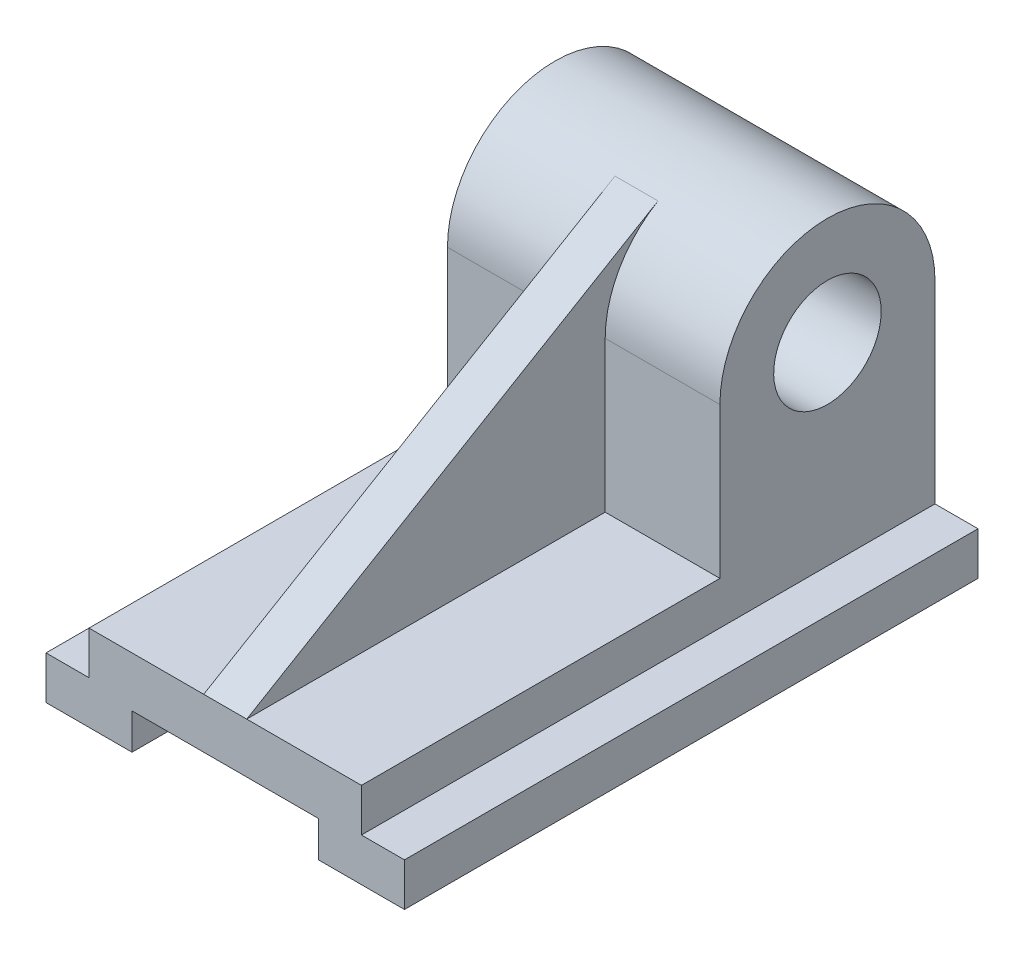
ISO-10303-21;
HEADER;
FILE_DESCRIPTION(('STEP AP214'),'2;1');
FILE_NAME('part.step','',(''),(''),'','','');
FILE_SCHEMA(('AUTOMOTIVE_DESIGN { 1 0 10303 214 1 1 1 1 }'));
ENDSEC;
DATA;
#1=APPLICATION_CONTEXT('core data for automotive mechanical design processes');
#2=APPLICATION_PROTOCOL_DEFINITION('international standard','automotive_design',2000,#1);
#3=PRODUCT_CONTEXT('',#1,'mechanical');
#4=PRODUCT('Part','Part','',(#3));
#5=PRODUCT_RELATED_PRODUCT_CATEGORY('part','',(#4));
#6=PRODUCT_DEFINITION_FORMATION('','',#4);
#7=PRODUCT_DEFINITION_CONTEXT('part definition',#1,'design');
#8=PRODUCT_DEFINITION('design','',#6,#7);
#9=PRODUCT_DEFINITION_SHAPE('','',#8);
#10=(LENGTH_UNIT() NAMED_UNIT(*) SI_UNIT(.MILLI.,.METRE.));
#11=(NAMED_UNIT(*) PLANE_ANGLE_UNIT() SI_UNIT($,.RADIAN.));
#12=(NAMED_UNIT(*) SI_UNIT($,.STERADIAN.) SOLID_ANGLE_UNIT());
#13=UNCERTAINTY_MEASURE_WITH_UNIT(LENGTH_MEASURE(1.E-05),#10,'distance_accuracy_value','');
#14=(GEOMETRIC_REPRESENTATION_CONTEXT(3) GLOBAL_UNCERTAINTY_ASSIGNED_CONTEXT((#13)) GLOBAL_UNIT_ASSIGNED_CONTEXT((#10,
#11,#12)) REPRESENTATION_CONTEXT('',''));
#15=CARTESIAN_POINT('',(0.,0.,0.));
#16=DIRECTION('',(0.,0.,1.));
#17=DIRECTION('',(1.,0.,0.));
#18=AXIS2_PLACEMENT_3D('',#15,#16,#17);
#19=CARTESIAN_POINT('',(0.,12.,80.));
#20=DIRECTION('',(0.,1.,0.));
#21=DIRECTION('',(0.,0.,1.));
#22=AXIS2_PLACEMENT_3D('',#19,#20,#21);
#23=PLANE('',#22);
#24=DIRECTION('',(1.,0.,0.));
#25=VECTOR('',#24,1.);
#26=CARTESIAN_POINT('',(0.,12.,80.));
#27=LINE('',#26,#25);
#28=CARTESIAN_POINT('',(-38.,12.,80.));
#29=VERTEX_POINT('',#28);
#30=CARTESIAN_POINT('',(-6.,12.,80.));
#31=VERTEX_POINT('',#30);
#32=EDGE_CURVE('E191',#29,#31,#27,.T.);
#33=ORIENTED_EDGE('',*,*,#32,.T.);
#34=DIRECTION('',(0.,0.,-1.));
#35=VECTOR('',#34,1.);
#36=CARTESIAN_POINT('',(-6.,12.,80.));
#37=LINE('',#36,#35);
#38=CARTESIAN_POINT('',(-6.,12.,-20.));
#39=VERTEX_POINT('',#38);
#40=EDGE_CURVE('E169',#31,#39,#37,.T.);
#41=ORIENTED_EDGE('',*,*,#40,.T.);
#42=DIRECTION('',(1.,0.,0.));
#43=VECTOR('',#42,1.);
#44=CARTESIAN_POINT('',(-38.,12.,-20.));
#45=LINE('',#44,#43);
#46=CARTESIAN_POINT('',(-38.,12.,-20.));
#47=VERTEX_POINT('',#46);
#48=EDGE_CURVE('E69',#47,#39,#45,.T.);
#49=ORIENTED_EDGE('',*,*,#48,.F.);
#50=DIRECTION('',(0.,0.,-1.));
#51=VECTOR('',#50,1.);
#52=CARTESIAN_POINT('',(-38.,12.,80.));
#53=LINE('',#52,#51);
#54=EDGE_CURVE('E198',#29,#47,#53,.T.);
#55=ORIENTED_EDGE('',*,*,#54,.F.);
#56=EDGE_LOOP('',(#33,#41,#49,#55));
#57=FACE_BOUND('',#56,.T.);
#58=ADVANCED_FACE('F45',(#57),#23,.T.);
#59=CARTESIAN_POINT('',(-38.,54.,-20.));
#60=DIRECTION('',(0.,0.,-1.));
#61=DIRECTION('',(-1.,0.,0.));
#62=AXIS2_PLACEMENT_3D('',#59,#60,#61);
#63=PLANE('',#62);
#64=DIRECTION('',(0.,-1.,0.));
#65=VECTOR('',#64,1.);
#66=CARTESIAN_POINT('',(-6.,54.,-20.));
#67=LINE('',#66,#65);
#68=CARTESIAN_POINT('',(-6.00000000000001,54.,-20.));
#69=VERTEX_POINT('',#68);
#70=EDGE_CURVE('E172',#69,#39,#67,.T.);
#71=ORIENTED_EDGE('',*,*,#70,.F.);
#72=DIRECTION('',(1.,0.,0.));
#73=VECTOR('',#72,1.);
#74=CARTESIAN_POINT('',(-38.,54.,-20.));
#75=LINE('',#74,#73);
#76=CARTESIAN_POINT('',(-38.,54.,-20.));
#77=VERTEX_POINT('',#76);
#78=EDGE_CURVE('E323',#77,#69,#75,.T.);
#79=ORIENTED_EDGE('',*,*,#78,.F.);
#80=DIRECTION('',(0.,-1.,0.));
#81=VECTOR('',#80,1.);
#82=CARTESIAN_POINT('',(-38.,54.,-20.));
#83=LINE('',#82,#81);
#84=EDGE_CURVE('E230',#77,#47,#83,.T.);
#85=ORIENTED_EDGE('',*,*,#84,.T.);
#86=ORIENTED_EDGE('',*,*,#48,.T.);
#87=EDGE_LOOP('',(#71,#79,#85,#86));
#88=FACE_BOUND('',#87,.T.);
#89=ADVANCED_FACE('F386',(#88),#63,.F.);
#90=CARTESIAN_POINT('',(26.,0.,80.));
#91=DIRECTION('',(-1.,0.,0.));
#92=DIRECTION('',(0.,0.,1.));
#93=AXIS2_PLACEMENT_3D('',#90,#91,#92);
#94=PLANE('',#93);
#95=DIRECTION('',(0.,1.,0.));
#96=VECTOR('',#95,1.);
#97=CARTESIAN_POINT('',(26.,0.,-80.));
#98=LINE('',#97,#96);
#99=CARTESIAN_POINT('',(26.,-12.,-80.));
#100=VERTEX_POINT('',#99);
#101=CARTESIAN_POINT('',(26.,-2.,-80.));
#102=VERTEX_POINT('',#101);
#103=EDGE_CURVE('E225',#100,#102,#98,.T.);
#104=ORIENTED_EDGE('',*,*,#103,.F.);
#105=DIRECTION('',(0.,0.,-1.));
#106=VECTOR('',#105,1.);
#107=CARTESIAN_POINT('',(26.,-12.,80.));
#108=LINE('',#107,#106);
#109=CARTESIAN_POINT('',(26.,-12.,80.));
#110=VERTEX_POINT('',#109);
#111=EDGE_CURVE('E54',#110,#100,#108,.T.);
#112=ORIENTED_EDGE('',*,*,#111,.F.);
#113=DIRECTION('',(0.,1.,0.));
#114=VECTOR('',#113,1.);
#115=CARTESIAN_POINT('',(26.,0.,80.));
#116=LINE('',#115,#114);
#117=CARTESIAN_POINT('',(26.,-2.,80.));
#118=VERTEX_POINT('',#117);
#119=EDGE_CURVE('E264',#110,#118,#116,.T.);
#120=ORIENTED_EDGE('',*,*,#119,.T.);
#121=DIRECTION('',(0.,0.,-1.));
#122=VECTOR('',#121,1.);
#123=CARTESIAN_POINT('',(26.,-2.,80.));
#124=LINE('',#123,#122);
#125=EDGE_CURVE('E224',#118,#102,#124,.T.);
#126=ORIENTED_EDGE('',*,*,#125,.T.);
#127=EDGE_LOOP('',(#104,#112,#120,#126));
#128=FACE_BOUND('',#127,.T.);
#129=ADVANCED_FACE('F47',(#128),#94,.T.);
#130=CARTESIAN_POINT('',(0.,-12.,80.));
#131=DIRECTION('',(0.,1.,0.));
#132=DIRECTION('',(0.,0.,1.));
#133=AXIS2_PLACEMENT_3D('',#130,#131,#132);
#134=PLANE('',#133);
#135=DIRECTION('',(1.,0.,0.));
#136=VECTOR('',#135,1.);
#137=CARTESIAN_POINT('',(0.,-12.,-80.));
#138=LINE('',#137,#136);
#139=CARTESIAN_POINT('',(50.,-12.,-80.));
#140=VERTEX_POINT('',#139);
#141=EDGE_CURVE('E229',#100,#140,#138,.T.);
#142=ORIENTED_EDGE('',*,*,#141,.T.);
#143=DIRECTION('',(0.,0.,-1.));
#144=VECTOR('',#143,1.);
#145=CARTESIAN_POINT('',(50.,-12.,80.));
#146=LINE('',#145,#144);
#147=CARTESIAN_POINT('',(50.,-12.,80.));
#148=VERTEX_POINT('',#147);
#149=EDGE_CURVE('E298',#148,#140,#146,.T.);
#150=ORIENTED_EDGE('',*,*,#149,.F.);
#151=DIRECTION('',(1.,0.,0.));
#152=VECTOR('',#151,1.);
#153=CARTESIAN_POINT('',(0.,-12.,80.));
#154=LINE('',#153,#152);
#155=EDGE_CURVE('E343',#110,#148,#154,.T.);
#156=ORIENTED_EDGE('',*,*,#155,.F.);
#157=ORIENTED_EDGE('',*,*,#111,.T.);
#158=EDGE_LOOP('',(#142,#150,#156,#157));
#159=FACE_BOUND('',#158,.T.);
#160=ADVANCED_FACE('F421',(#159),#134,.F.);
#161=CARTESIAN_POINT('',(50.,0.,80.));
#162=DIRECTION('',(1.,0.,0.));
#163=DIRECTION('',(0.,0.,-1.));
#164=AXIS2_PLACEMENT_3D('',#161,#162,#163);
#165=PLANE('',#164);
#166=DIRECTION('',(0.,-1.,0.));
#167=VECTOR('',#166,1.);
#168=CARTESIAN_POINT('',(50.,0.,-80.));
#169=LINE('',#168,#167);
#170=CARTESIAN_POINT('',(50.,0.,-80.));
#171=VERTEX_POINT('',#170);
#172=EDGE_CURVE('E234',#171,#140,#169,.T.);
#173=ORIENTED_EDGE('',*,*,#172,.F.);
#174=DIRECTION('',(0.,0.,-1.));
#175=VECTOR('',#174,1.);
#176=CARTESIAN_POINT('',(50.,0.,80.));
#177=LINE('',#176,#175);
#178=CARTESIAN_POINT('',(50.,0.,80.));
#179=VERTEX_POINT('',#178);
#180=EDGE_CURVE('E295',#179,#171,#177,.T.);
#181=ORIENTED_EDGE('',*,*,#180,.F.);
#182=DIRECTION('',(0.,-1.,0.));
#183=VECTOR('',#182,1.);
#184=CARTESIAN_POINT('',(50.,0.,80.));
#185=LINE('',#184,#183);
#186=EDGE_CURVE('E346',#179,#148,#185,.T.);
#187=ORIENTED_EDGE('',*,*,#186,.T.);
#188=ORIENTED_EDGE('',*,*,#149,.T.);
#189=EDGE_LOOP('',(#173,#181,#187,#188));
#190=FACE_BOUND('',#189,.T.);
#191=ADVANCED_FACE('F425',(#190),#165,.T.);
#192=CARTESIAN_POINT('',(0.,0.,80.));
#193=DIRECTION('',(0.,-1.,0.));
#194=DIRECTION('',(1.,0.,0.));
#195=AXIS2_PLACEMENT_3D('',#192,#193,#194);
#196=PLANE('',#195);
#197=DIRECTION('',(-1.,0.,0.));
#198=VECTOR('',#197,1.);
#199=CARTESIAN_POINT('',(0.,0.,-80.));
#200=LINE('',#199,#198);
#201=CARTESIAN_POINT('',(38.,0.,-80.));
#202=VERTEX_POINT('',#201);
#203=EDGE_CURVE('E239',#171,#202,#200,.T.);
#204=ORIENTED_EDGE('',*,*,#203,.T.);
#205=DIRECTION('',(0.,0.,-1.));
#206=VECTOR('',#205,1.);
#207=CARTESIAN_POINT('',(38.,0.,80.));
#208=LINE('',#207,#206);
#209=CARTESIAN_POINT('',(38.,0.,80.));
#210=VERTEX_POINT('',#209);
#211=EDGE_CURVE('E292',#210,#202,#208,.T.);
#212=ORIENTED_EDGE('',*,*,#211,.F.);
#213=DIRECTION('',(-1.,0.,0.));
#214=VECTOR('',#213,1.);
#215=CARTESIAN_POINT('',(0.,0.,80.));
#216=LINE('',#215,#214);
#217=EDGE_CURVE('E349',#179,#210,#216,.T.);
#218=ORIENTED_EDGE('',*,*,#217,.F.);
#219=ORIENTED_EDGE('',*,*,#180,.T.);
#220=EDGE_LOOP('',(#204,#212,#218,#219));
#221=FACE_BOUND('',#220,.T.);
#222=ADVANCED_FACE('F428',(#221),#196,.F.);
#223=CARTESIAN_POINT('',(38.,0.,80.));
#224=DIRECTION('',(1.,0.,0.));
#225=DIRECTION('',(0.,1.,0.));
#226=AXIS2_PLACEMENT_3D('',#223,#224,#225);
#227=PLANE('',#226);
#228=CARTESIAN_POINT('',(38.,54.,-50.));
#229=DIRECTION('',(1.,0.,0.));
#230=DIRECTION('',(0.,1.,0.));
#231=AXIS2_PLACEMENT_3D('',#228,#229,#230);
#232=CIRCLE('',#231,15.);
#233=CARTESIAN_POINT('',(38.,69.,-50.));
#234=VERTEX_POINT('',#233);
#235=EDGE_CURVE('E195',#234,#234,#232,.T.);
#236=ORIENTED_EDGE('',*,*,#235,.F.);
#237=EDGE_LOOP('',(#236));
#238=FACE_BOUND('',#237,.T.);
#239=DIRECTION('',(0.,-1.,0.));
#240=VECTOR('',#239,1.);
#241=CARTESIAN_POINT('',(38.,0.,-80.));
#242=LINE('',#241,#240);
#243=CARTESIAN_POINT('',(38.,54.,-80.));
#244=VERTEX_POINT('',#243);
#245=EDGE_CURVE('E243',#244,#202,#242,.T.);
#246=ORIENTED_EDGE('',*,*,#245,.F.);
#247=CARTESIAN_POINT('',(38.,54.,-50.));
#248=DIRECTION('',(1.,0.,0.));
#249=DIRECTION('',(0.,1.,0.));
#250=AXIS2_PLACEMENT_3D('',#247,#248,#249);
#251=CIRCLE('',#250,30.);
#252=CARTESIAN_POINT('',(38.,54.,-20.));
#253=VERTEX_POINT('',#252);
#254=EDGE_CURVE('E305',#244,#253,#251,.T.);
#255=ORIENTED_EDGE('',*,*,#254,.T.);
#256=DIRECTION('',(0.,-1.,0.));
#257=VECTOR('',#256,1.);
#258=CARTESIAN_POINT('',(38.,54.,-20.));
#259=LINE('',#258,#257);
#260=CARTESIAN_POINT('',(38.,12.,-20.));
#261=VERTEX_POINT('',#260);
#262=EDGE_CURVE('E331',#253,#261,#259,.T.);
#263=ORIENTED_EDGE('',*,*,#262,.T.);
#264=DIRECTION('',(0.,0.,-1.));
#265=VECTOR('',#264,1.);
#266=CARTESIAN_POINT('',(38.,12.,80.));
#267=LINE('',#266,#265);
#268=CARTESIAN_POINT('',(38.,12.,80.));
#269=VERTEX_POINT('',#268);
#270=EDGE_CURVE('E288',#269,#261,#267,.T.);
#271=ORIENTED_EDGE('',*,*,#270,.F.);
#272=DIRECTION('',(0.,-1.,0.));
#273=VECTOR('',#272,1.);
#274=CARTESIAN_POINT('',(38.,0.,80.));
#275=LINE('',#274,#273);
#276=EDGE_CURVE('E207',#269,#210,#275,.T.);
#277=ORIENTED_EDGE('',*,*,#276,.T.);
#278=ORIENTED_EDGE('',*,*,#211,.T.);
#279=EDGE_LOOP('',(#246,#255,#263,#271,#277,#278));
#280=FACE_BOUND('',#279,.T.);
#281=ADVANCED_FACE('F358',(#238,#280),#227,.T.);
#282=DIRECTION('',(0.,0.,-1.));
#283=VECTOR('',#282,1.);
#284=CARTESIAN_POINT('',(6.,12.,80.));
#285=LINE('',#284,#283);
#286=CARTESIAN_POINT('',(6.,12.,80.));
#287=VERTEX_POINT('',#286);
#288=CARTESIAN_POINT('',(6.,12.,-20.));
#289=VERTEX_POINT('',#288);
#290=EDGE_CURVE('E196',#287,#289,#285,.T.);
#291=ORIENTED_EDGE('',*,*,#290,.F.);
#292=EDGE_CURVE('E193',#287,#269,#27,.T.);
#293=ORIENTED_EDGE('',*,*,#292,.T.);
#294=ORIENTED_EDGE('',*,*,#270,.T.);
#295=EDGE_CURVE('E322',#289,#261,#45,.T.);
#296=ORIENTED_EDGE('',*,*,#295,.F.);
#297=EDGE_LOOP('',(#291,#293,#294,#296));
#298=FACE_BOUND('',#297,.T.);
#299=ADVANCED_FACE('F363',(#298),#23,.T.);
#300=CARTESIAN_POINT('',(-38.,0.,80.));
#301=DIRECTION('',(1.,0.,0.));
#302=DIRECTION('',(0.,1.,0.));
#303=AXIS2_PLACEMENT_3D('',#300,#301,#302);
#304=PLANE('',#303);
#305=CARTESIAN_POINT('',(-38.,54.,-50.));
#306=DIRECTION('',(1.,0.,0.));
#307=DIRECTION('',(0.,1.,0.));
#308=AXIS2_PLACEMENT_3D('',#305,#306,#307);
#309=CIRCLE('',#308,15.);
#310=CARTESIAN_POINT('',(-38.,69.,-50.));
#311=VERTEX_POINT('',#310);
#312=EDGE_CURVE('E302',#311,#311,#309,.T.);
#313=ORIENTED_EDGE('',*,*,#312,.T.);
#314=EDGE_LOOP('',(#313));
#315=FACE_BOUND('',#314,.T.);
#316=ORIENTED_EDGE('',*,*,#84,.F.);
#317=CARTESIAN_POINT('',(-38.,54.,-50.));
#318=DIRECTION('',(1.,0.,0.));
#319=DIRECTION('',(0.,1.,0.));
#320=AXIS2_PLACEMENT_3D('',#317,#318,#319);
#321=CIRCLE('',#320,30.);
#322=CARTESIAN_POINT('',(-38.,54.,-80.));
#323=VERTEX_POINT('',#322);
#324=EDGE_CURVE('E311',#77,#323,#321,.F.);
#325=ORIENTED_EDGE('',*,*,#324,.T.);
#326=DIRECTION('',(0.,-1.,0.));
#327=VECTOR('',#326,1.);
#328=CARTESIAN_POINT('',(-38.,0.,-80.));
#329=LINE('',#328,#327);
#330=CARTESIAN_POINT('',(-38.,0.,-80.));
#331=VERTEX_POINT('',#330);
#332=EDGE_CURVE('E247',#323,#331,#329,.T.);
#333=ORIENTED_EDGE('',*,*,#332,.T.);
#334=DIRECTION('',(0.,0.,-1.));
#335=VECTOR('',#334,1.);
#336=CARTESIAN_POINT('',(-38.,0.,80.));
#337=LINE('',#336,#335);
#338=CARTESIAN_POINT('',(-38.,0.,80.));
#339=VERTEX_POINT('',#338);
#340=EDGE_CURVE('E283',#339,#331,#337,.T.);
#341=ORIENTED_EDGE('',*,*,#340,.F.);
#342=DIRECTION('',(0.,-1.,0.));
#343=VECTOR('',#342,1.);
#344=CARTESIAN_POINT('',(-38.,0.,80.));
#345=LINE('',#344,#343);
#346=EDGE_CURVE('E201',#29,#339,#345,.T.);
#347=ORIENTED_EDGE('',*,*,#346,.F.);
#348=ORIENTED_EDGE('',*,*,#54,.T.);
#349=EDGE_LOOP('',(#316,#325,#333,#341,#347,#348));
#350=FACE_BOUND('',#349,.T.);
#351=ADVANCED_FACE('F388',(#315,#350),#304,.F.);
#352=CARTESIAN_POINT('',(0.,0.,80.));
#353=DIRECTION('',(0.,1.,0.));
#354=DIRECTION('',(0.,0.,1.));
#355=AXIS2_PLACEMENT_3D('',#352,#353,#354);
#356=PLANE('',#355);
#357=DIRECTION('',(1.,0.,0.));
#358=VECTOR('',#357,1.);
#359=CARTESIAN_POINT('',(0.,0.,-80.));
#360=LINE('',#359,#358);
#361=CARTESIAN_POINT('',(-50.,0.,-80.));
#362=VERTEX_POINT('',#361);
#363=EDGE_CURVE('E251',#362,#331,#360,.T.);
#364=ORIENTED_EDGE('',*,*,#363,.F.);
#365=DIRECTION('',(0.,0.,-1.));
#366=VECTOR('',#365,1.);
#367=CARTESIAN_POINT('',(-50.,0.,80.));
#368=LINE('',#367,#366);
#369=CARTESIAN_POINT('',(-50.,0.,80.));
#370=VERTEX_POINT('',#369);
#371=EDGE_CURVE('E280',#370,#362,#368,.T.);
#372=ORIENTED_EDGE('',*,*,#371,.F.);
#373=DIRECTION('',(1.,0.,0.));
#374=VECTOR('',#373,1.);
#375=CARTESIAN_POINT('',(0.,0.,80.));
#376=LINE('',#375,#374);
#377=EDGE_CURVE('E205',#370,#339,#376,.T.);
#378=ORIENTED_EDGE('',*,*,#377,.T.);
#379=ORIENTED_EDGE('',*,*,#340,.T.);
#380=EDGE_LOOP('',(#364,#372,#378,#379));
#381=FACE_BOUND('',#380,.T.);
#382=ADVANCED_FACE('F395',(#381),#356,.T.);
#383=CARTESIAN_POINT('',(-50.,0.,80.));
#384=DIRECTION('',(1.,0.,0.));
#385=DIRECTION('',(0.,0.,-1.));
#386=AXIS2_PLACEMENT_3D('',#383,#384,#385);
#387=PLANE('',#386);
#388=DIRECTION('',(0.,-1.,0.));
#389=VECTOR('',#388,1.);
#390=CARTESIAN_POINT('',(-50.,0.,-80.));
#391=LINE('',#390,#389);
#392=CARTESIAN_POINT('',(-50.,-12.,-80.));
#393=VERTEX_POINT('',#392);
#394=EDGE_CURVE('E255',#362,#393,#391,.T.);
#395=ORIENTED_EDGE('',*,*,#394,.T.);
#396=DIRECTION('',(0.,0.,-1.));
#397=VECTOR('',#396,1.);
#398=CARTESIAN_POINT('',(-50.,-12.,80.));
#399=LINE('',#398,#397);
#400=CARTESIAN_POINT('',(-50.,-12.,80.));
#401=VERTEX_POINT('',#400);
#402=EDGE_CURVE('E276',#401,#393,#399,.T.);
#403=ORIENTED_EDGE('',*,*,#402,.F.);
#404=DIRECTION('',(0.,-1.,0.));
#405=VECTOR('',#404,1.);
#406=CARTESIAN_POINT('',(-50.,0.,80.));
#407=LINE('',#406,#405);
#408=EDGE_CURVE('E214',#370,#401,#407,.T.);
#409=ORIENTED_EDGE('',*,*,#408,.F.);
#410=ORIENTED_EDGE('',*,*,#371,.T.);
#411=EDGE_LOOP('',(#395,#403,#409,#410));
#412=FACE_BOUND('',#411,.T.);
#413=ADVANCED_FACE('F398',(#412),#387,.F.);
#414=CARTESIAN_POINT('',(-26.,-12.,-80.));
#415=VERTEX_POINT('',#414);
#416=EDGE_CURVE('E235',#393,#415,#138,.T.);
#417=ORIENTED_EDGE('',*,*,#416,.T.);
#418=DIRECTION('',(0.,0.,-1.));
#419=VECTOR('',#418,1.);
#420=CARTESIAN_POINT('',(-26.,-12.,80.));
#421=LINE('',#420,#419);
#422=CARTESIAN_POINT('',(-26.,-12.,80.));
#423=VERTEX_POINT('',#422);
#424=EDGE_CURVE('E272',#423,#415,#421,.T.);
#425=ORIENTED_EDGE('',*,*,#424,.F.);
#426=EDGE_CURVE('E217',#401,#423,#154,.T.);
#427=ORIENTED_EDGE('',*,*,#426,.F.);
#428=ORIENTED_EDGE('',*,*,#402,.T.);
#429=EDGE_LOOP('',(#417,#425,#427,#428));
#430=FACE_BOUND('',#429,.T.);
#431=ADVANCED_FACE('F403',(#430),#134,.F.);
#432=CARTESIAN_POINT('',(-26.,0.,80.));
#433=DIRECTION('',(-1.,0.,0.));
#434=DIRECTION('',(0.,0.,1.));
#435=AXIS2_PLACEMENT_3D('',#432,#433,#434);
#436=PLANE('',#435);
#437=DIRECTION('',(0.,1.,0.));
#438=VECTOR('',#437,1.);
#439=CARTESIAN_POINT('',(-26.,0.,-80.));
#440=LINE('',#439,#438);
#441=CARTESIAN_POINT('',(-26.,-2.,-80.));
#442=VERTEX_POINT('',#441);
#443=EDGE_CURVE('E258',#415,#442,#440,.T.);
#444=ORIENTED_EDGE('',*,*,#443,.T.);
#445=DIRECTION('',(0.,0.,-1.));
#446=VECTOR('',#445,1.);
#447=CARTESIAN_POINT('',(-26.,-2.,80.));
#448=LINE('',#447,#446);
#449=CARTESIAN_POINT('',(-26.,-2.,80.));
#450=VERTEX_POINT('',#449);
#451=EDGE_CURVE('E268',#450,#442,#448,.T.);
#452=ORIENTED_EDGE('',*,*,#451,.F.);
#453=DIRECTION('',(0.,1.,0.));
#454=VECTOR('',#453,1.);
#455=CARTESIAN_POINT('',(-26.,0.,80.));
#456=LINE('',#455,#454);
#457=EDGE_CURVE('E218',#423,#450,#456,.T.);
#458=ORIENTED_EDGE('',*,*,#457,.F.);
#459=ORIENTED_EDGE('',*,*,#424,.T.);
#460=EDGE_LOOP('',(#444,#452,#458,#459));
#461=FACE_BOUND('',#460,.T.);
#462=ADVANCED_FACE('F411',(#461),#436,.F.);
#463=CARTESIAN_POINT('',(0.,-2.,80.));
#464=DIRECTION('',(0.,1.,0.));
#465=DIRECTION('',(0.,0.,1.));
#466=AXIS2_PLACEMENT_3D('',#463,#464,#465);
#467=PLANE('',#466);
#468=ORIENTED_EDGE('',*,*,#125,.F.);
#469=DIRECTION('',(1.,0.,0.));
#470=VECTOR('',#469,1.);
#471=CARTESIAN_POINT('',(0.,-2.,80.));
#472=LINE('',#471,#470);
#473=EDGE_CURVE('E221',#450,#118,#472,.T.);
#474=ORIENTED_EDGE('',*,*,#473,.F.);
#475=ORIENTED_EDGE('',*,*,#451,.T.);
#476=DIRECTION('',(1.,0.,0.));
#477=VECTOR('',#476,1.);
#478=CARTESIAN_POINT('',(0.,-2.,-80.));
#479=LINE('',#478,#477);
#480=EDGE_CURVE('E261',#442,#102,#479,.T.);
#481=ORIENTED_EDGE('',*,*,#480,.T.);
#482=EDGE_LOOP('',(#468,#474,#475,#481));
#483=FACE_BOUND('',#482,.T.);
#484=ADVANCED_FACE('F415',(#483),#467,.F.);
#485=CARTESIAN_POINT('',(0.,0.,80.));
#486=DIRECTION('',(0.,0.,1.));
#487=DIRECTION('',(1.,0.,0.));
#488=AXIS2_PLACEMENT_3D('',#485,#486,#487);
#489=PLANE('',#488);
#490=ORIENTED_EDGE('',*,*,#292,.F.);
#491=DIRECTION('',(1.,0.,0.));
#492=VECTOR('',#491,1.);
#493=CARTESIAN_POINT('',(0.,12.,80.));
#494=LINE('',#493,#492);
#495=EDGE_CURVE('E181',#287,#31,#494,.F.);
#496=ORIENTED_EDGE('',*,*,#495,.T.);
#497=ORIENTED_EDGE('',*,*,#32,.F.);
#498=ORIENTED_EDGE('',*,*,#346,.T.);
#499=ORIENTED_EDGE('',*,*,#377,.F.);
#500=ORIENTED_EDGE('',*,*,#408,.T.);
#501=ORIENTED_EDGE('',*,*,#426,.T.);
#502=ORIENTED_EDGE('',*,*,#457,.T.);
#503=ORIENTED_EDGE('',*,*,#473,.T.);
#504=ORIENTED_EDGE('',*,*,#119,.F.);
#505=ORIENTED_EDGE('',*,*,#155,.T.);
#506=ORIENTED_EDGE('',*,*,#186,.F.);
#507=ORIENTED_EDGE('',*,*,#217,.T.);
#508=ORIENTED_EDGE('',*,*,#276,.F.);
#509=EDGE_LOOP('',(#490,#496,#497,#498,#499,#500,#501,#502,#503,#504,#505,#506,#507,#508));
#510=FACE_BOUND('',#509,.T.);
#511=ADVANCED_FACE('F190',(#510),#489,.T.);
#512=CARTESIAN_POINT('',(0.,0.,-80.));
#513=DIRECTION('',(0.,0.,1.));
#514=DIRECTION('',(1.,0.,0.));
#515=AXIS2_PLACEMENT_3D('',#512,#513,#514);
#516=PLANE('',#515);
#517=ORIENTED_EDGE('',*,*,#103,.T.);
#518=ORIENTED_EDGE('',*,*,#480,.F.);
#519=ORIENTED_EDGE('',*,*,#443,.F.);
#520=ORIENTED_EDGE('',*,*,#416,.F.);
#521=ORIENTED_EDGE('',*,*,#394,.F.);
#522=ORIENTED_EDGE('',*,*,#363,.T.);
#523=ORIENTED_EDGE('',*,*,#332,.F.);
#524=DIRECTION('',(-1.,0.,0.));
#525=VECTOR('',#524,1.);
#526=CARTESIAN_POINT('',(-38.,54.,-80.));
#527=LINE('',#526,#525);
#528=EDGE_CURVE('E327',#244,#323,#527,.T.);
#529=ORIENTED_EDGE('',*,*,#528,.F.);
#530=ORIENTED_EDGE('',*,*,#245,.T.);
#531=ORIENTED_EDGE('',*,*,#203,.F.);
#532=ORIENTED_EDGE('',*,*,#172,.T.);
#533=ORIENTED_EDGE('',*,*,#141,.F.);
#534=EDGE_LOOP('',(#517,#518,#519,#520,#521,#522,#523,#529,#530,#531,#532,#533));
#535=FACE_BOUND('',#534,.T.);
#536=ADVANCED_FACE('F431',(#535),#516,.F.);
#537=CARTESIAN_POINT('',(6.00000000000001,54.,-20.));
#538=VERTEX_POINT('',#537);
#539=EDGE_CURVE('E328',#538,#253,#75,.T.);
#540=ORIENTED_EDGE('',*,*,#539,.F.);
#541=DIRECTION('',(0.,-1.,0.));
#542=VECTOR('',#541,1.);
#543=CARTESIAN_POINT('',(6.,54.,-20.));
#544=LINE('',#543,#542);
#545=EDGE_CURVE('E367',#538,#289,#544,.T.);
#546=ORIENTED_EDGE('',*,*,#545,.T.);
#547=ORIENTED_EDGE('',*,*,#295,.T.);
#548=ORIENTED_EDGE('',*,*,#262,.F.);
#549=EDGE_LOOP('',(#540,#546,#547,#548));
#550=FACE_BOUND('',#549,.T.);
#551=ADVANCED_FACE('F436',(#550),#63,.F.);
#552=CARTESIAN_POINT('',(-122.852813742386,53.9999999999999,-50.));
#553=DIRECTION('',(1.,0.,0.));
#554=DIRECTION('',(0.,1.,0.));
#555=AXIS2_PLACEMENT_3D('',#552,#553,#554);
#556=CYLINDRICAL_SURFACE('',#555,30.);
#557=ORIENTED_EDGE('',*,*,#528,.T.);
#558=ORIENTED_EDGE('',*,*,#324,.F.);
#559=ORIENTED_EDGE('',*,*,#78,.T.);
#560=CARTESIAN_POINT('',(-6.00000000000001,54.,-50.));
#561=DIRECTION('',(1.,0.,0.));
#562=DIRECTION('',(0.,0.,-1.));
#563=AXIS2_PLACEMENT_3D('',#560,#561,#562);
#564=CIRCLE('',#563,30.);
#565=CARTESIAN_POINT('',(-6.00000000000001,79.8250354127847,-34.7334500974088));
#566=VERTEX_POINT('',#565);
#567=EDGE_CURVE('E375',#69,#566,#564,.F.);
#568=ORIENTED_EDGE('',*,*,#567,.T.);
#569=DIRECTION('',(1.,0.,0.));
#570=VECTOR('',#569,1.);
#571=CARTESIAN_POINT('',(-122.852813742386,79.8250354127855,-34.7334500974084));
#572=LINE('',#571,#570);
#573=CARTESIAN_POINT('',(6.00000000000001,79.8250354127847,-34.7334500974088));
#574=VERTEX_POINT('',#573);
#575=EDGE_CURVE('E11',#566,#574,#572,.T.);
#576=ORIENTED_EDGE('',*,*,#575,.T.);
#577=CARTESIAN_POINT('',(6.00000000000001,54.,-50.));
#578=DIRECTION('',(1.,0.,0.));
#579=DIRECTION('',(0.,0.,-1.));
#580=AXIS2_PLACEMENT_3D('',#577,#578,#579);
#581=CIRCLE('',#580,30.);
#582=EDGE_CURVE('E175',#538,#574,#581,.F.);
#583=ORIENTED_EDGE('',*,*,#582,.F.);
#584=ORIENTED_EDGE('',*,*,#539,.T.);
#585=ORIENTED_EDGE('',*,*,#254,.F.);
#586=EDGE_LOOP('',(#557,#558,#559,#568,#576,#583,#584,#585));
#587=FACE_BOUND('',#586,.T.);
#588=ADVANCED_FACE('F381',(#587),#556,.T.);
#589=CARTESIAN_POINT('',(-50.,54.,-50.));
#590=DIRECTION('',(1.,0.,0.));
#591=DIRECTION('',(0.,1.,0.));
#592=AXIS2_PLACEMENT_3D('',#589,#590,#591);
#593=CYLINDRICAL_SURFACE('',#592,15.);
#594=ORIENTED_EDGE('',*,*,#235,.T.);
#595=EDGE_LOOP('',(#594));
#596=FACE_BOUND('',#595,.T.);
#597=ORIENTED_EDGE('',*,*,#312,.F.);
#598=EDGE_LOOP('',(#597));
#599=FACE_BOUND('',#598,.T.);
#600=ADVANCED_FACE('F447',(#596,#599),#593,.F.);
#601=CARTESIAN_POINT('',(0.,12.,80.));
#602=DIRECTION('',(0.,-0.860834513759543,-0.508884996753069));
#603=DIRECTION('',(0.,0.508884996753069,-0.860834513759543));
#604=AXIS2_PLACEMENT_3D('',#601,#602,#603);
#605=PLANE('',#604);
#606=ORIENTED_EDGE('',*,*,#495,.F.);
#607=DIRECTION('',(0.,0.508884996753069,-0.860834513759543));
#608=VECTOR('',#607,1.);
#609=CARTESIAN_POINT('',(6.,12.,80.));
#610=LINE('',#609,#608);
#611=EDGE_CURVE('E185',#287,#574,#610,.T.);
#612=ORIENTED_EDGE('',*,*,#611,.T.);
#613=ORIENTED_EDGE('',*,*,#575,.F.);
#614=DIRECTION('',(0.,0.508884996753069,-0.860834513759543));
#615=VECTOR('',#614,1.);
#616=CARTESIAN_POINT('',(-6.,12.,80.));
#617=LINE('',#616,#615);
#618=EDGE_CURVE('E61',#31,#566,#617,.T.);
#619=ORIENTED_EDGE('',*,*,#618,.F.);
#620=EDGE_LOOP('',(#606,#612,#613,#619));
#621=FACE_BOUND('',#620,.T.);
#622=ADVANCED_FACE('F179',(#621),#605,.F.);
#623=CARTESIAN_POINT('',(6.,36.,0.));
#624=DIRECTION('',(1.,0.,0.));
#625=DIRECTION('',(0.,0.,-1.));
#626=AXIS2_PLACEMENT_3D('',#623,#624,#625);
#627=PLANE('',#626);
#628=ORIENTED_EDGE('',*,*,#611,.F.);
#629=ORIENTED_EDGE('',*,*,#290,.T.);
#630=ORIENTED_EDGE('',*,*,#545,.F.);
#631=ORIENTED_EDGE('',*,*,#582,.T.);
#632=EDGE_LOOP('',(#628,#629,#630,#631));
#633=FACE_BOUND('',#632,.T.);
#634=ADVANCED_FACE('F439',(#633),#627,.T.);
#635=CARTESIAN_POINT('',(-6.,36.,0.));
#636=DIRECTION('',(1.,0.,0.));
#637=DIRECTION('',(0.,0.,-1.));
#638=AXIS2_PLACEMENT_3D('',#635,#636,#637);
#639=PLANE('',#638);
#640=ORIENTED_EDGE('',*,*,#40,.F.);
#641=ORIENTED_EDGE('',*,*,#618,.T.);
#642=ORIENTED_EDGE('',*,*,#567,.F.);
#643=ORIENTED_EDGE('',*,*,#70,.T.);
#644=EDGE_LOOP('',(#640,#641,#642,#643));
#645=FACE_BOUND('',#644,.T.);
#646=ADVANCED_FACE('F170',(#645),#639,.F.);
#647=CLOSED_SHELL('',(#58,#89,#129,#160,#191,#222,#281,#299,#351,#382,#413,#431,#462,#484,#511,
#536,#551,#588,#600,#622,#634,#646));
#648=MANIFOLD_SOLID_BREP('B2',#647);
#649=ADVANCED_BREP_SHAPE_REPRESENTATION('',(#18,#648),#14);
#650=SHAPE_DEFINITION_REPRESENTATION(#9,#649);
ENDSEC;
END-ISO-10303-21;
